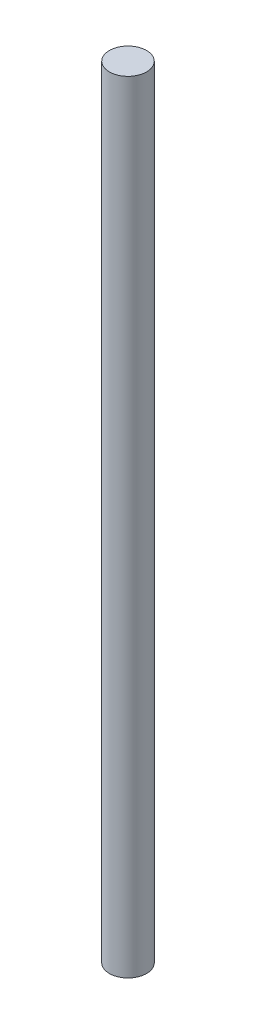
ISO-10303-21;
HEADER;
FILE_DESCRIPTION(('STEP AP214'),'2;1');
FILE_NAME('part.step','',(''),(''),'','','');
FILE_SCHEMA(('AUTOMOTIVE_DESIGN { 1 0 10303 214 1 1 1 1 }'));
ENDSEC;
DATA;
#1=APPLICATION_CONTEXT('core data for automotive mechanical design processes');
#2=APPLICATION_PROTOCOL_DEFINITION('international standard','automotive_design',2000,#1);
#3=PRODUCT_CONTEXT('',#1,'mechanical');
#4=PRODUCT('Part','Part','',(#3));
#5=PRODUCT_RELATED_PRODUCT_CATEGORY('part','',(#4));
#6=PRODUCT_DEFINITION_FORMATION('','',#4);
#7=PRODUCT_DEFINITION_CONTEXT('part definition',#1,'design');
#8=PRODUCT_DEFINITION('design','',#6,#7);
#9=PRODUCT_DEFINITION_SHAPE('','',#8);
#10=(LENGTH_UNIT() NAMED_UNIT(*) SI_UNIT(.MILLI.,.METRE.));
#11=(NAMED_UNIT(*) PLANE_ANGLE_UNIT() SI_UNIT($,.RADIAN.));
#12=(NAMED_UNIT(*) SI_UNIT($,.STERADIAN.) SOLID_ANGLE_UNIT());
#13=UNCERTAINTY_MEASURE_WITH_UNIT(LENGTH_MEASURE(1.E-05),#10,'distance_accuracy_value','');
#14=(GEOMETRIC_REPRESENTATION_CONTEXT(3) GLOBAL_UNCERTAINTY_ASSIGNED_CONTEXT((#13)) GLOBAL_UNIT_ASSIGNED_CONTEXT((#10,
#11,#12)) REPRESENTATION_CONTEXT('',''));
#15=CARTESIAN_POINT('',(0.,0.,0.));
#16=DIRECTION('',(0.,0.,1.));
#17=DIRECTION('',(1.,0.,0.));
#18=AXIS2_PLACEMENT_3D('',#15,#16,#17);
#19=CARTESIAN_POINT('',(0.,420.,0.));
#20=DIRECTION('',(0.,-1.,0.));
#21=DIRECTION('',(0.,0.,-1.));
#22=AXIS2_PLACEMENT_3D('',#19,#20,#21);
#23=CYLINDRICAL_SURFACE('',#22,10.);
#24=CARTESIAN_POINT('',(0.,420.,0.));
#25=DIRECTION('',(0.,1.,0.));
#26=DIRECTION('',(0.,0.,1.));
#27=AXIS2_PLACEMENT_3D('',#24,#25,#26);
#28=CIRCLE('',#27,10.);
#29=CARTESIAN_POINT('',(0.,420.,10.));
#30=VERTEX_POINT('',#29);
#31=EDGE_CURVE('E10',#30,#30,#28,.T.);
#32=ORIENTED_EDGE('',*,*,#31,.F.);
#33=EDGE_LOOP('',(#32));
#34=FACE_BOUND('',#33,.T.);
#35=CARTESIAN_POINT('',(0.,0.,0.));
#36=DIRECTION('',(0.,1.,0.));
#37=DIRECTION('',(0.,0.,1.));
#38=AXIS2_PLACEMENT_3D('',#35,#36,#37);
#39=CIRCLE('',#38,10.);
#40=CARTESIAN_POINT('',(0.,0.,10.));
#41=VERTEX_POINT('',#40);
#42=EDGE_CURVE('E33',#41,#41,#39,.T.);
#43=ORIENTED_EDGE('',*,*,#42,.T.);
#44=EDGE_LOOP('',(#43));
#45=FACE_BOUND('',#44,.T.);
#46=ADVANCED_FACE('F30',(#34,#45),#23,.T.);
#47=CARTESIAN_POINT('',(0.,420.,0.));
#48=DIRECTION('',(0.,1.,0.));
#49=DIRECTION('',(0.,0.,1.));
#50=AXIS2_PLACEMENT_3D('',#47,#48,#49);
#51=PLANE('',#50);
#52=ORIENTED_EDGE('',*,*,#31,.T.);
#53=EDGE_LOOP('',(#52));
#54=FACE_BOUND('',#53,.T.);
#55=ADVANCED_FACE('F45',(#54),#51,.T.);
#56=CARTESIAN_POINT('',(0.,0.,0.));
#57=DIRECTION('',(0.,1.,0.));
#58=DIRECTION('',(0.,0.,1.));
#59=AXIS2_PLACEMENT_3D('',#56,#57,#58);
#60=PLANE('',#59);
#61=ORIENTED_EDGE('',*,*,#42,.F.);
#62=EDGE_LOOP('',(#61));
#63=FACE_BOUND('',#62,.T.);
#64=ADVANCED_FACE('F43',(#63),#60,.F.);
#65=CLOSED_SHELL('',(#46,#55,#64));
#66=MANIFOLD_SOLID_BREP('B2',#65);
#67=ADVANCED_BREP_SHAPE_REPRESENTATION('',(#18,#66),#14);
#68=SHAPE_DEFINITION_REPRESENTATION(#9,#67);
ENDSEC;
END-ISO-10303-21;
